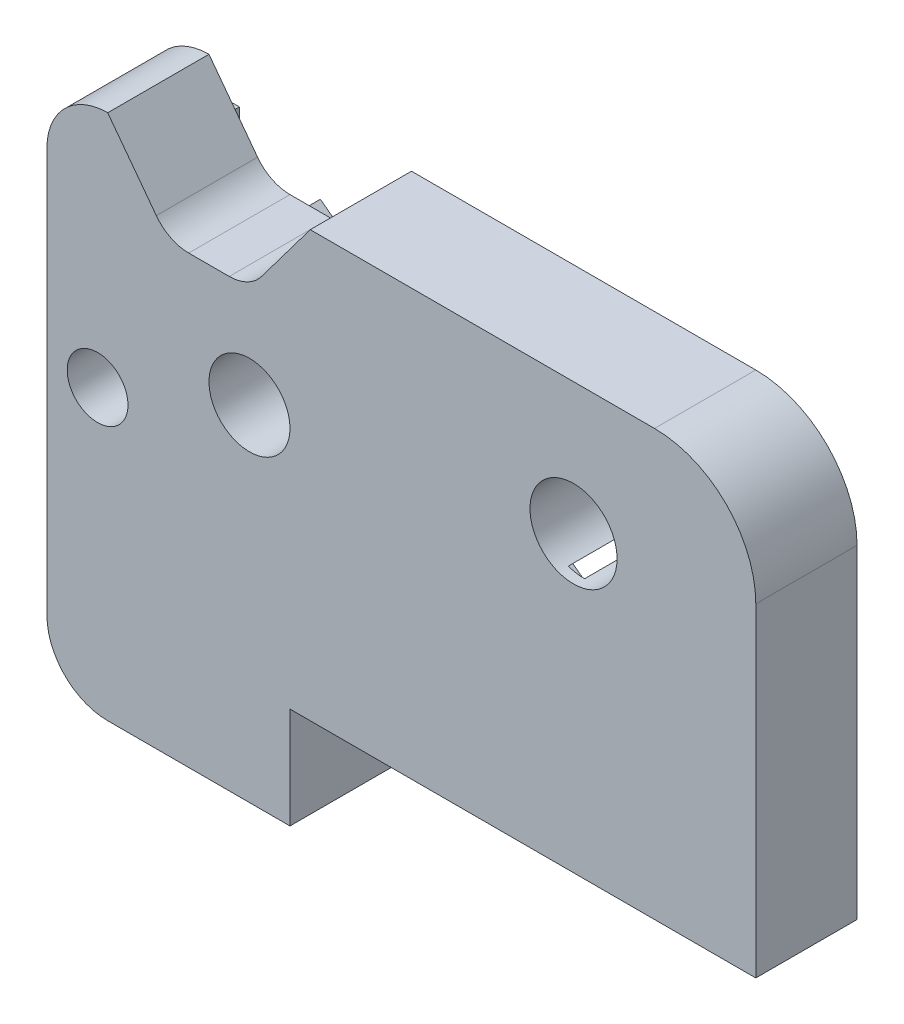
ISO-10303-21;
HEADER;
FILE_DESCRIPTION(('STEP AP214'),'2;1');
FILE_NAME('part.step','',(''),(''),'','','');
FILE_SCHEMA(('AUTOMOTIVE_DESIGN { 1 0 10303 214 1 1 1 1 }'));
ENDSEC;
DATA;
#1=APPLICATION_CONTEXT('core data for automotive mechanical design processes');
#2=APPLICATION_PROTOCOL_DEFINITION('international standard','automotive_design',2000,#1);
#3=PRODUCT_CONTEXT('',#1,'mechanical');
#4=PRODUCT('Part','Part','',(#3));
#5=PRODUCT_RELATED_PRODUCT_CATEGORY('part','',(#4));
#6=PRODUCT_DEFINITION_FORMATION('','',#4);
#7=PRODUCT_DEFINITION_CONTEXT('part definition',#1,'design');
#8=PRODUCT_DEFINITION('design','',#6,#7);
#9=PRODUCT_DEFINITION_SHAPE('','',#8);
#10=(LENGTH_UNIT() NAMED_UNIT(*) SI_UNIT(.MILLI.,.METRE.));
#11=(NAMED_UNIT(*) PLANE_ANGLE_UNIT() SI_UNIT($,.RADIAN.));
#12=(NAMED_UNIT(*) SI_UNIT($,.STERADIAN.) SOLID_ANGLE_UNIT());
#13=UNCERTAINTY_MEASURE_WITH_UNIT(LENGTH_MEASURE(1.E-05),#10,'distance_accuracy_value','');
#14=(GEOMETRIC_REPRESENTATION_CONTEXT(3) GLOBAL_UNCERTAINTY_ASSIGNED_CONTEXT((#13)) GLOBAL_UNIT_ASSIGNED_CONTEXT((#10,
#11,#12)) REPRESENTATION_CONTEXT('',''));
#15=CARTESIAN_POINT('',(0.,0.,0.));
#16=DIRECTION('',(0.,0.,1.));
#17=DIRECTION('',(1.,0.,0.));
#18=AXIS2_PLACEMENT_3D('',#15,#16,#17);
#19=CARTESIAN_POINT('',(-8.,6.5,0.));
#20=DIRECTION('',(0.,0.,1.));
#21=DIRECTION('',(1.,0.,0.));
#22=AXIS2_PLACEMENT_3D('',#19,#20,#21);
#23=PLANE('',#22);
#24=CARTESIAN_POINT('',(-17.,3.5,0.));
#25=DIRECTION('',(0.,0.,1.));
#26=DIRECTION('',(1.,0.,0.));
#27=AXIS2_PLACEMENT_3D('',#24,#25,#26);
#28=CIRCLE('',#27,3.);
#29=CARTESIAN_POINT('',(-20.,3.5,0.));
#30=VERTEX_POINT('',#29);
#31=CARTESIAN_POINT('',(-17.,6.5,0.));
#32=VERTEX_POINT('',#31);
#33=EDGE_CURVE('E416',#30,#32,#28,.F.);
#34=ORIENTED_EDGE('',*,*,#33,.T.);
#35=DIRECTION('',(-0.6,0.8,0.));
#36=VECTOR('',#35,1.);
#37=CARTESIAN_POINT('',(-14.,2.5,0.));
#38=LINE('',#37,#36);
#39=CARTESIAN_POINT('',(-14.6,3.3,0.));
#40=VERTEX_POINT('',#39);
#41=EDGE_CURVE('E223',#40,#32,#38,.T.);
#42=ORIENTED_EDGE('',*,*,#41,.F.);
#43=CARTESIAN_POINT('',(-13.,4.5,0.));
#44=DIRECTION('',(0.,0.,1.));
#45=DIRECTION('',(1.,0.,0.));
#46=AXIS2_PLACEMENT_3D('',#43,#44,#45);
#47=CIRCLE('',#46,2.);
#48=CARTESIAN_POINT('',(-13.,2.5,0.));
#49=VERTEX_POINT('',#48);
#50=EDGE_CURVE('E11',#40,#49,#47,.T.);
#51=ORIENTED_EDGE('',*,*,#50,.T.);
#52=DIRECTION('',(-1.,0.,0.));
#53=VECTOR('',#52,1.);
#54=CARTESIAN_POINT('',(-14.,2.5,0.));
#55=LINE('',#54,#53);
#56=CARTESIAN_POINT('',(-11.,2.5,0.));
#57=VERTEX_POINT('',#56);
#58=EDGE_CURVE('E513',#57,#49,#55,.T.);
#59=ORIENTED_EDGE('',*,*,#58,.F.);
#60=CARTESIAN_POINT('',(-11.,4.5,0.));
#61=DIRECTION('',(0.,0.,1.));
#62=DIRECTION('',(1.,0.,0.));
#63=AXIS2_PLACEMENT_3D('',#60,#61,#62);
#64=CIRCLE('',#63,2.);
#65=CARTESIAN_POINT('',(-9.40000000000001,3.3,0.));
#66=VERTEX_POINT('',#65);
#67=EDGE_CURVE('E374',#57,#66,#64,.T.);
#68=ORIENTED_EDGE('',*,*,#67,.T.);
#69=DIRECTION('',(-0.600000000000001,-0.799999999999999,0.));
#70=VECTOR('',#69,1.);
#71=CARTESIAN_POINT('',(-10.,2.5,0.));
#72=LINE('',#71,#70);
#73=CARTESIAN_POINT('',(-7.,6.5,0.));
#74=VERTEX_POINT('',#73);
#75=EDGE_CURVE('E392',#74,#66,#72,.T.);
#76=ORIENTED_EDGE('',*,*,#75,.F.);
#77=DIRECTION('',(-1.,0.,0.));
#78=VECTOR('',#77,1.);
#79=CARTESIAN_POINT('',(15.,6.5,0.));
#80=LINE('',#79,#78);
#81=CARTESIAN_POINT('',(10.,6.5,0.));
#82=VERTEX_POINT('',#81);
#83=EDGE_CURVE('E222',#82,#74,#80,.T.);
#84=ORIENTED_EDGE('',*,*,#83,.F.);
#85=CARTESIAN_POINT('',(10.,1.5,0.));
#86=DIRECTION('',(0.,0.,1.));
#87=DIRECTION('',(1.,0.,0.));
#88=AXIS2_PLACEMENT_3D('',#85,#86,#87);
#89=CIRCLE('',#88,5.);
#90=CARTESIAN_POINT('',(15.,1.49999999999999,0.));
#91=VERTEX_POINT('',#90);
#92=EDGE_CURVE('E511',#82,#91,#89,.F.);
#93=ORIENTED_EDGE('',*,*,#92,.T.);
#94=DIRECTION('',(0.,1.,0.));
#95=VECTOR('',#94,1.);
#96=CARTESIAN_POINT('',(15.,-14.5,0.));
#97=LINE('',#96,#95);
#98=CARTESIAN_POINT('',(15.,-14.5,0.));
#99=VERTEX_POINT('',#98);
#100=EDGE_CURVE('E231',#99,#91,#97,.T.);
#101=ORIENTED_EDGE('',*,*,#100,.F.);
#102=DIRECTION('',(1.,0.,0.));
#103=VECTOR('',#102,1.);
#104=CARTESIAN_POINT('',(-8.,-14.5,0.));
#105=LINE('',#104,#103);
#106=CARTESIAN_POINT('',(-2.00000000000001,-14.5,0.));
#107=VERTEX_POINT('',#106);
#108=EDGE_CURVE('E236',#107,#99,#105,.T.);
#109=ORIENTED_EDGE('',*,*,#108,.F.);
#110=DIRECTION('',(0.,-1.,0.));
#111=VECTOR('',#110,1.);
#112=CARTESIAN_POINT('',(-2.,-11.07,0.));
#113=LINE('',#112,#111);
#114=CARTESIAN_POINT('',(-2.,-11.07,0.));
#115=VERTEX_POINT('',#114);
#116=EDGE_CURVE('E430',#115,#107,#113,.T.);
#117=ORIENTED_EDGE('',*,*,#116,.F.);
#118=DIRECTION('',(0.800119256629199,-0.599840958230711,0.));
#119=VECTOR('',#118,1.);
#120=CARTESIAN_POINT('',(-18.1,1.,0.));
#121=LINE('',#120,#119);
#122=CARTESIAN_POINT('',(-15.5,-0.949192546583849,0.));
#123=VERTEX_POINT('',#122);
#124=EDGE_CURVE('E435',#123,#115,#121,.T.);
#125=ORIENTED_EDGE('',*,*,#124,.F.);
#126=DIRECTION('',(0.,-1.,0.));
#127=VECTOR('',#126,1.);
#128=CARTESIAN_POINT('',(-15.5,-7.49999999999999,0.));
#129=LINE('',#128,#127);
#130=CARTESIAN_POINT('',(-15.5,-5.49999999999999,0.));
#131=VERTEX_POINT('',#130);
#132=EDGE_CURVE('E527',#123,#131,#129,.T.);
#133=ORIENTED_EDGE('',*,*,#132,.T.);
#134=CARTESIAN_POINT('',(-17.5,-5.49999999999999,0.));
#135=DIRECTION('',(0.,0.,1.));
#136=DIRECTION('',(1.,0.,0.));
#137=AXIS2_PLACEMENT_3D('',#134,#135,#136);
#138=CIRCLE('',#137,2.);
#139=CARTESIAN_POINT('',(-17.5,-7.49999999999999,0.));
#140=VERTEX_POINT('',#139);
#141=EDGE_CURVE('E400',#131,#140,#138,.F.);
#142=ORIENTED_EDGE('',*,*,#141,.T.);
#143=CARTESIAN_POINT('',(-17.5,-5.49999999999999,0.));
#144=DIRECTION('',(0.,0.,1.));
#145=DIRECTION('',(1.,0.,0.));
#146=AXIS2_PLACEMENT_3D('',#143,#144,#145);
#147=CIRCLE('',#146,2.);
#148=CARTESIAN_POINT('',(-19.5,-5.49999999999999,0.));
#149=VERTEX_POINT('',#148);
#150=EDGE_CURVE('E398',#140,#149,#147,.F.);
#151=ORIENTED_EDGE('',*,*,#150,.T.);
#152=DIRECTION('',(0.,1.,0.));
#153=VECTOR('',#152,1.);
#154=CARTESIAN_POINT('',(-19.5,1.00000000000001,0.));
#155=LINE('',#154,#153);
#156=CARTESIAN_POINT('',(-19.5,1.00000000000001,0.));
#157=VERTEX_POINT('',#156);
#158=EDGE_CURVE('E524',#149,#157,#155,.T.);
#159=ORIENTED_EDGE('',*,*,#158,.T.);
#160=DIRECTION('',(1.,0.,0.));
#161=VECTOR('',#160,1.);
#162=CARTESIAN_POINT('',(-20.,1.,0.));
#163=LINE('',#162,#161);
#164=CARTESIAN_POINT('',(-20.,1.00000000000001,0.));
#165=VERTEX_POINT('',#164);
#166=EDGE_CURVE('E269',#165,#157,#163,.T.);
#167=ORIENTED_EDGE('',*,*,#166,.F.);
#168=DIRECTION('',(0.,1.,0.));
#169=VECTOR('',#168,1.);
#170=CARTESIAN_POINT('',(-20.,6.5,0.));
#171=LINE('',#170,#169);
#172=EDGE_CURVE('E263',#165,#30,#171,.T.);
#173=ORIENTED_EDGE('',*,*,#172,.T.);
#174=EDGE_LOOP('',(#34,#42,#51,#59,#68,#76,#84,#93,#101,#109,#117,#125,#133,#142,#151,#159,#167,#173));
#175=FACE_BOUND('',#174,.T.);
#176=CARTESIAN_POINT('',(4.9,-6.5,0.));
#177=DIRECTION('',(0.,0.,-1.));
#178=DIRECTION('',(-1.,0.,0.));
#179=AXIS2_PLACEMENT_3D('',#176,#177,#178);
#180=CIRCLE('',#179,4.5);
#181=CARTESIAN_POINT('',(0.4,-6.5,0.));
#182=VERTEX_POINT('',#181);
#183=EDGE_CURVE('E289',#182,#182,#180,.T.);
#184=ORIENTED_EDGE('',*,*,#183,.F.);
#185=EDGE_LOOP('',(#184));
#186=FACE_BOUND('',#185,.T.);
#187=CARTESIAN_POINT('',(-17.5,-5.5,0.));
#188=DIRECTION('',(0.,0.,1.));
#189=DIRECTION('',(1.,0.,0.));
#190=AXIS2_PLACEMENT_3D('',#187,#188,#189);
#191=CIRCLE('',#190,1.5);
#192=CARTESIAN_POINT('',(-16.,-5.5,0.));
#193=VERTEX_POINT('',#192);
#194=EDGE_CURVE('E532',#193,#193,#191,.F.);
#195=ORIENTED_EDGE('',*,*,#194,.F.);
#196=EDGE_LOOP('',(#195));
#197=FACE_BOUND('',#196,.T.);
#198=ADVANCED_FACE('F36',(#175,#186,#197),#23,.F.);
#199=CARTESIAN_POINT('',(15.,6.5,5.));
#200=DIRECTION('',(0.,-1.,0.));
#201=DIRECTION('',(1.,0.,0.));
#202=AXIS2_PLACEMENT_3D('',#199,#200,#201);
#203=PLANE('',#202);
#204=ORIENTED_EDGE('',*,*,#83,.T.);
#205=DIRECTION('',(0.,0.,1.));
#206=VECTOR('',#205,1.);
#207=CARTESIAN_POINT('',(-7.,6.5,-10.770329614269));
#208=LINE('',#207,#206);
#209=CARTESIAN_POINT('',(-7.,6.5,5.));
#210=VERTEX_POINT('',#209);
#211=EDGE_CURVE('E206',#74,#210,#208,.T.);
#212=ORIENTED_EDGE('',*,*,#211,.T.);
#213=DIRECTION('',(-1.,0.,0.));
#214=VECTOR('',#213,1.);
#215=CARTESIAN_POINT('',(15.,6.5,5.));
#216=LINE('',#215,#214);
#217=CARTESIAN_POINT('',(10.,6.5,5.));
#218=VERTEX_POINT('',#217);
#219=EDGE_CURVE('E219',#218,#210,#216,.T.);
#220=ORIENTED_EDGE('',*,*,#219,.F.);
#221=DIRECTION('',(0.,0.,-1.));
#222=VECTOR('',#221,1.);
#223=CARTESIAN_POINT('',(10.,6.5,5.));
#224=LINE('',#223,#222);
#225=EDGE_CURVE('E251',#218,#82,#224,.T.);
#226=ORIENTED_EDGE('',*,*,#225,.T.);
#227=EDGE_LOOP('',(#204,#212,#220,#226));
#228=FACE_BOUND('',#227,.T.);
#229=ADVANCED_FACE('F217',(#228),#203,.F.);
#230=CARTESIAN_POINT('',(-8.,-14.5,5.));
#231=DIRECTION('',(0.,1.,0.));
#232=DIRECTION('',(0.,0.,1.));
#233=AXIS2_PLACEMENT_3D('',#230,#231,#232);
#234=PLANE('',#233);
#235=CARTESIAN_POINT('',(12.,-14.5,2.5));
#236=DIRECTION('',(0.,-1.,0.));
#237=DIRECTION('',(0.,0.,-1.));
#238=AXIS2_PLACEMENT_3D('',#235,#236,#237);
#239=CIRCLE('',#238,1.25);
#240=CARTESIAN_POINT('',(12.,-14.5,1.25));
#241=VERTEX_POINT('',#240);
#242=EDGE_CURVE('E297',#241,#241,#239,.T.);
#243=ORIENTED_EDGE('',*,*,#242,.F.);
#244=EDGE_LOOP('',(#243));
#245=FACE_BOUND('',#244,.T.);
#246=CARTESIAN_POINT('',(-1.4,-14.5,2.5));
#247=DIRECTION('',(0.,-1.,0.));
#248=DIRECTION('',(0.,0.,-1.));
#249=AXIS2_PLACEMENT_3D('',#246,#247,#248);
#250=CIRCLE('',#249,1.25);
#251=CARTESIAN_POINT('',(-1.4,-14.5,1.25));
#252=VERTEX_POINT('',#251);
#253=EDGE_CURVE('E300',#252,#252,#250,.T.);
#254=ORIENTED_EDGE('',*,*,#253,.F.);
#255=EDGE_LOOP('',(#254));
#256=FACE_BOUND('',#255,.T.);
#257=DIRECTION('',(0.,0.,-1.));
#258=VECTOR('',#257,1.);
#259=CARTESIAN_POINT('',(-8.,-14.5,5.));
#260=LINE('',#259,#258);
#261=CARTESIAN_POINT('',(-8.,-14.5,5.));
#262=VERTEX_POINT('',#261);
#263=CARTESIAN_POINT('',(-8.,-14.5,-4.));
#264=VERTEX_POINT('',#263);
#265=EDGE_CURVE('E248',#262,#264,#260,.T.);
#266=ORIENTED_EDGE('',*,*,#265,.T.);
#267=DIRECTION('',(-1.,0.,0.));
#268=VECTOR('',#267,1.);
#269=CARTESIAN_POINT('',(-2.00000000000001,-14.5,-4.));
#270=LINE('',#269,#268);
#271=CARTESIAN_POINT('',(-2.00000000000001,-14.5,-4.));
#272=VERTEX_POINT('',#271);
#273=EDGE_CURVE('E543',#272,#264,#270,.T.);
#274=ORIENTED_EDGE('',*,*,#273,.F.);
#275=DIRECTION('',(0.,0.,1.));
#276=VECTOR('',#275,1.);
#277=CARTESIAN_POINT('',(-2.00000000000001,-14.5,-4.));
#278=LINE('',#277,#276);
#279=EDGE_CURVE('E425',#272,#107,#278,.T.);
#280=ORIENTED_EDGE('',*,*,#279,.T.);
#281=ORIENTED_EDGE('',*,*,#108,.T.);
#282=DIRECTION('',(0.,0.,-1.));
#283=VECTOR('',#282,1.);
#284=CARTESIAN_POINT('',(15.,-14.5,5.));
#285=LINE('',#284,#283);
#286=CARTESIAN_POINT('',(15.,-14.5,5.));
#287=VERTEX_POINT('',#286);
#288=EDGE_CURVE('E243',#287,#99,#285,.T.);
#289=ORIENTED_EDGE('',*,*,#288,.F.);
#290=DIRECTION('',(1.,0.,0.));
#291=VECTOR('',#290,1.);
#292=CARTESIAN_POINT('',(-8.,-14.5,5.));
#293=LINE('',#292,#291);
#294=EDGE_CURVE('E230',#262,#287,#293,.T.);
#295=ORIENTED_EDGE('',*,*,#294,.F.);
#296=EDGE_LOOP('',(#266,#274,#280,#281,#289,#295));
#297=FACE_BOUND('',#296,.T.);
#298=ADVANCED_FACE('F321',(#245,#256,#297),#234,.F.);
#299=CARTESIAN_POINT('',(15.,-14.5,5.));
#300=DIRECTION('',(-1.,0.,0.));
#301=DIRECTION('',(0.,0.,1.));
#302=AXIS2_PLACEMENT_3D('',#299,#300,#301);
#303=PLANE('',#302);
#304=ORIENTED_EDGE('',*,*,#100,.T.);
#305=DIRECTION('',(0.,0.,-1.));
#306=VECTOR('',#305,1.);
#307=CARTESIAN_POINT('',(15.,1.5,5.));
#308=LINE('',#307,#306);
#309=CARTESIAN_POINT('',(15.,1.49999999999999,5.));
#310=VERTEX_POINT('',#309);
#311=EDGE_CURVE('E508',#91,#310,#308,.F.);
#312=ORIENTED_EDGE('',*,*,#311,.T.);
#313=DIRECTION('',(0.,1.,0.));
#314=VECTOR('',#313,1.);
#315=CARTESIAN_POINT('',(15.,-14.5,5.));
#316=LINE('',#315,#314);
#317=EDGE_CURVE('E233',#287,#310,#316,.T.);
#318=ORIENTED_EDGE('',*,*,#317,.F.);
#319=ORIENTED_EDGE('',*,*,#288,.T.);
#320=EDGE_LOOP('',(#304,#312,#318,#319));
#321=FACE_BOUND('',#320,.T.);
#322=ADVANCED_FACE('F312',(#321),#303,.F.);
#323=CARTESIAN_POINT('',(-8.,6.5,5.));
#324=DIRECTION('',(0.,0.,1.));
#325=DIRECTION('',(1.,0.,0.));
#326=AXIS2_PLACEMENT_3D('',#323,#324,#325);
#327=PLANE('',#326);
#328=DIRECTION('',(0.6,-0.8,0.));
#329=VECTOR('',#328,1.);
#330=CARTESIAN_POINT('',(-14.,2.5,5.));
#331=LINE('',#330,#329);
#332=CARTESIAN_POINT('',(-17.,6.5,5.));
#333=VERTEX_POINT('',#332);
#334=CARTESIAN_POINT('',(-14.6,3.3,5.));
#335=VERTEX_POINT('',#334);
#336=EDGE_CURVE('E211',#333,#335,#331,.T.);
#337=ORIENTED_EDGE('',*,*,#336,.F.);
#338=CARTESIAN_POINT('',(-17.,3.5,5.));
#339=DIRECTION('',(0.,0.,1.));
#340=DIRECTION('',(1.,0.,0.));
#341=AXIS2_PLACEMENT_3D('',#338,#339,#340);
#342=CIRCLE('',#341,3.);
#343=CARTESIAN_POINT('',(-20.,3.5,5.));
#344=VERTEX_POINT('',#343);
#345=EDGE_CURVE('E410',#333,#344,#342,.T.);
#346=ORIENTED_EDGE('',*,*,#345,.T.);
#347=DIRECTION('',(0.,1.,0.));
#348=VECTOR('',#347,1.);
#349=CARTESIAN_POINT('',(-20.,6.5,5.));
#350=LINE('',#349,#348);
#351=CARTESIAN_POINT('',(-20.,-16.5,5.));
#352=VERTEX_POINT('',#351);
#353=EDGE_CURVE('E277',#352,#344,#350,.T.);
#354=ORIENTED_EDGE('',*,*,#353,.F.);
#355=CARTESIAN_POINT('',(-17.,-16.5,5.));
#356=DIRECTION('',(0.,0.,1.));
#357=DIRECTION('',(1.,0.,0.));
#358=AXIS2_PLACEMENT_3D('',#355,#356,#357);
#359=CIRCLE('',#358,3.);
#360=CARTESIAN_POINT('',(-17.,-19.5,5.));
#361=VERTEX_POINT('',#360);
#362=EDGE_CURVE('E412',#352,#361,#359,.T.);
#363=ORIENTED_EDGE('',*,*,#362,.T.);
#364=DIRECTION('',(-1.,0.,0.));
#365=VECTOR('',#364,1.);
#366=CARTESIAN_POINT('',(-8.,-19.5,5.));
#367=LINE('',#366,#365);
#368=CARTESIAN_POINT('',(-8.,-19.5,5.));
#369=VERTEX_POINT('',#368);
#370=EDGE_CURVE('E267',#369,#361,#367,.T.);
#371=ORIENTED_EDGE('',*,*,#370,.F.);
#372=DIRECTION('',(0.,-1.,0.));
#373=VECTOR('',#372,1.);
#374=CARTESIAN_POINT('',(-8.,6.5,5.));
#375=LINE('',#374,#373);
#376=EDGE_CURVE('E282',#262,#369,#375,.T.);
#377=ORIENTED_EDGE('',*,*,#376,.F.);
#378=ORIENTED_EDGE('',*,*,#294,.T.);
#379=ORIENTED_EDGE('',*,*,#317,.T.);
#380=CARTESIAN_POINT('',(10.,1.5,5.));
#381=DIRECTION('',(0.,0.,1.));
#382=DIRECTION('',(1.,0.,0.));
#383=AXIS2_PLACEMENT_3D('',#380,#381,#382);
#384=CIRCLE('',#383,5.);
#385=EDGE_CURVE('E229',#310,#218,#384,.T.);
#386=ORIENTED_EDGE('',*,*,#385,.T.);
#387=ORIENTED_EDGE('',*,*,#219,.T.);
#388=DIRECTION('',(0.600000000000001,0.799999999999999,0.));
#389=VECTOR('',#388,1.);
#390=CARTESIAN_POINT('',(-10.,2.5,5.));
#391=LINE('',#390,#389);
#392=CARTESIAN_POINT('',(-9.40000000000001,3.3,5.));
#393=VERTEX_POINT('',#392);
#394=EDGE_CURVE('E202',#393,#210,#391,.T.);
#395=ORIENTED_EDGE('',*,*,#394,.F.);
#396=CARTESIAN_POINT('',(-11.,4.5,5.));
#397=DIRECTION('',(0.,0.,1.));
#398=DIRECTION('',(1.,0.,0.));
#399=AXIS2_PLACEMENT_3D('',#396,#397,#398);
#400=CIRCLE('',#399,2.);
#401=CARTESIAN_POINT('',(-11.,2.5,5.));
#402=VERTEX_POINT('',#401);
#403=EDGE_CURVE('E377',#393,#402,#400,.F.);
#404=ORIENTED_EDGE('',*,*,#403,.T.);
#405=DIRECTION('',(1.,0.,0.));
#406=VECTOR('',#405,1.);
#407=CARTESIAN_POINT('',(-14.,2.5,5.));
#408=LINE('',#407,#406);
#409=CARTESIAN_POINT('',(-13.,2.5,5.));
#410=VERTEX_POINT('',#409);
#411=EDGE_CURVE('E212',#410,#402,#408,.T.);
#412=ORIENTED_EDGE('',*,*,#411,.F.);
#413=CARTESIAN_POINT('',(-13.,4.5,5.));
#414=DIRECTION('',(0.,0.,1.));
#415=DIRECTION('',(1.,0.,0.));
#416=AXIS2_PLACEMENT_3D('',#413,#414,#415);
#417=CIRCLE('',#416,2.);
#418=EDGE_CURVE('E44',#410,#335,#417,.F.);
#419=ORIENTED_EDGE('',*,*,#418,.T.);
#420=EDGE_LOOP('',(#337,#346,#354,#363,#371,#377,#378,#379,#386,#387,#395,#404,#412,#419));
#421=FACE_BOUND('',#420,.T.);
#422=CARTESIAN_POINT('',(-10.,-2.5,5.));
#423=DIRECTION('',(0.,0.,1.));
#424=DIRECTION('',(1.,0.,0.));
#425=AXIS2_PLACEMENT_3D('',#422,#423,#424);
#426=CIRCLE('',#425,2.);
#427=CARTESIAN_POINT('',(-8.,-2.5,5.));
#428=VERTEX_POINT('',#427);
#429=EDGE_CURVE('E451',#428,#428,#426,.T.);
#430=ORIENTED_EDGE('',*,*,#429,.F.);
#431=EDGE_LOOP('',(#430));
#432=FACE_BOUND('',#431,.T.);
#433=CARTESIAN_POINT('',(-17.5,-5.5,5.));
#434=DIRECTION('',(0.,0.,1.));
#435=DIRECTION('',(1.,0.,0.));
#436=AXIS2_PLACEMENT_3D('',#433,#434,#435);
#437=CIRCLE('',#436,1.5);
#438=CARTESIAN_POINT('',(-16.,-5.5,5.));
#439=VERTEX_POINT('',#438);
#440=EDGE_CURVE('E268',#439,#439,#437,.T.);
#441=ORIENTED_EDGE('',*,*,#440,.F.);
#442=EDGE_LOOP('',(#441));
#443=FACE_BOUND('',#442,.T.);
#444=CARTESIAN_POINT('',(6.,0.,5.));
#445=DIRECTION('',(0.,0.,1.));
#446=DIRECTION('',(1.,0.,0.));
#447=AXIS2_PLACEMENT_3D('',#444,#445,#446);
#448=CIRCLE('',#447,2.15);
#449=CARTESIAN_POINT('',(8.15,0.,5.));
#450=VERTEX_POINT('',#449);
#451=EDGE_CURVE('E240',#450,#450,#448,.T.);
#452=ORIENTED_EDGE('',*,*,#451,.F.);
#453=EDGE_LOOP('',(#452));
#454=FACE_BOUND('',#453,.T.);
#455=ADVANCED_FACE('F225',(#421,#432,#443,#454),#327,.T.);
#456=CARTESIAN_POINT('',(6.,0.,0.5));
#457=DIRECTION('',(0.,0.,1.));
#458=DIRECTION('',(1.,0.,0.));
#459=AXIS2_PLACEMENT_3D('',#456,#457,#458);
#460=CYLINDRICAL_SURFACE('',#459,2.15);
#461=CARTESIAN_POINT('',(6.,0.,0.5));
#462=DIRECTION('',(0.,0.,1.));
#463=DIRECTION('',(1.,0.,0.));
#464=AXIS2_PLACEMENT_3D('',#461,#462,#463);
#465=CIRCLE('',#464,2.15);
#466=CARTESIAN_POINT('',(6.0499763573965,-2.1494190758671,0.5));
#467=VERTEX_POINT('',#466);
#468=CARTESIAN_POINT('',(5.24556552019209,-2.01328801110943,0.5));
#469=VERTEX_POINT('',#468);
#470=EDGE_CURVE('E244',#467,#469,#465,.T.);
#471=ORIENTED_EDGE('',*,*,#470,.F.);
#472=DIRECTION('',(0.,0.,-1.));
#473=VECTOR('',#472,1.);
#474=CARTESIAN_POINT('',(6.0499763573965,-2.1494190758671,2.25));
#475=LINE('',#474,#473);
#476=CARTESIAN_POINT('',(6.0499763573965,-2.1494190758671,4.5));
#477=VERTEX_POINT('',#476);
#478=EDGE_CURVE('E294',#467,#477,#475,.F.);
#479=ORIENTED_EDGE('',*,*,#478,.T.);
#480=CARTESIAN_POINT('',(6.,0.,4.5));
#481=DIRECTION('',(0.,0.,-1.));
#482=DIRECTION('',(-1.,0.,0.));
#483=AXIS2_PLACEMENT_3D('',#480,#481,#482);
#484=CIRCLE('',#483,2.15);
#485=CARTESIAN_POINT('',(5.24556552019209,-2.01328801110943,4.5));
#486=VERTEX_POINT('',#485);
#487=EDGE_CURVE('E256',#486,#477,#484,.F.);
#488=ORIENTED_EDGE('',*,*,#487,.F.);
#489=DIRECTION('',(0.,0.,-1.));
#490=VECTOR('',#489,1.);
#491=CARTESIAN_POINT('',(5.24556552019209,-2.01328801110943,2.25));
#492=LINE('',#491,#490);
#493=EDGE_CURVE('E288',#486,#469,#492,.T.);
#494=ORIENTED_EDGE('',*,*,#493,.T.);
#495=EDGE_LOOP('',(#471,#479,#488,#494));
#496=FACE_BOUND('',#495,.T.);
#497=ORIENTED_EDGE('',*,*,#451,.T.);
#498=EDGE_LOOP('',(#497));
#499=FACE_BOUND('',#498,.T.);
#500=ADVANCED_FACE('F309',(#496,#499),#460,.F.);
#501=CARTESIAN_POINT('',(6.,0.,0.5));
#502=DIRECTION('',(0.,0.,1.));
#503=DIRECTION('',(1.,0.,0.));
#504=AXIS2_PLACEMENT_3D('',#501,#502,#503);
#505=PLANE('',#504);
#506=CARTESIAN_POINT('',(4.9,-6.5,0.5));
#507=DIRECTION('',(0.,0.,1.));
#508=DIRECTION('',(1.,0.,0.));
#509=AXIS2_PLACEMENT_3D('',#506,#507,#508);
#510=CIRCLE('',#509,4.5);
#511=EDGE_CURVE('E504',#467,#469,#510,.T.);
#512=ORIENTED_EDGE('',*,*,#511,.F.);
#513=ORIENTED_EDGE('',*,*,#470,.T.);
#514=EDGE_LOOP('',(#512,#513));
#515=FACE_BOUND('',#514,.T.);
#516=ADVANCED_FACE('F318',(#515),#505,.T.);
#517=CARTESIAN_POINT('',(-1.4,-6.5,2.5));
#518=DIRECTION('',(0.,-1.,0.));
#519=DIRECTION('',(0.,0.,-1.));
#520=AXIS2_PLACEMENT_3D('',#517,#518,#519);
#521=CYLINDRICAL_SURFACE('',#520,1.25);
#522=CARTESIAN_POINT('',(-1.4,-6.5,2.5));
#523=DIRECTION('',(0.,-1.,0.));
#524=DIRECTION('',(0.,0.,-1.));
#525=AXIS2_PLACEMENT_3D('',#522,#523,#524);
#526=CIRCLE('',#525,1.25);
#527=CARTESIAN_POINT('',(-1.4,-6.5,1.25));
#528=VERTEX_POINT('',#527);
#529=EDGE_CURVE('E445',#528,#528,#526,.T.);
#530=ORIENTED_EDGE('',*,*,#529,.F.);
#531=EDGE_LOOP('',(#530));
#532=FACE_BOUND('',#531,.T.);
#533=ORIENTED_EDGE('',*,*,#253,.T.);
#534=EDGE_LOOP('',(#533));
#535=FACE_BOUND('',#534,.T.);
#536=ADVANCED_FACE('F496',(#532,#535),#521,.F.);
#537=CARTESIAN_POINT('',(12.,-6.5,2.5));
#538=DIRECTION('',(0.,-1.,0.));
#539=DIRECTION('',(0.,0.,-1.));
#540=AXIS2_PLACEMENT_3D('',#537,#538,#539);
#541=CYLINDRICAL_SURFACE('',#540,1.25);
#542=CARTESIAN_POINT('',(12.,-6.5,2.5));
#543=DIRECTION('',(0.,-1.,0.));
#544=DIRECTION('',(0.,0.,-1.));
#545=AXIS2_PLACEMENT_3D('',#542,#543,#544);
#546=CIRCLE('',#545,1.25);
#547=CARTESIAN_POINT('',(12.,-6.5,1.25));
#548=VERTEX_POINT('',#547);
#549=EDGE_CURVE('E448',#548,#548,#546,.T.);
#550=ORIENTED_EDGE('',*,*,#549,.F.);
#551=EDGE_LOOP('',(#550));
#552=FACE_BOUND('',#551,.T.);
#553=ORIENTED_EDGE('',*,*,#242,.T.);
#554=EDGE_LOOP('',(#553));
#555=FACE_BOUND('',#554,.T.);
#556=ADVANCED_FACE('F341',(#552,#555),#541,.F.);
#557=CARTESIAN_POINT('',(10.,1.5,5.));
#558=DIRECTION('',(0.,0.,-1.));
#559=DIRECTION('',(-1.,0.,0.));
#560=AXIS2_PLACEMENT_3D('',#557,#558,#559);
#561=CYLINDRICAL_SURFACE('',#560,5.);
#562=ORIENTED_EDGE('',*,*,#385,.F.);
#563=ORIENTED_EDGE('',*,*,#311,.F.);
#564=ORIENTED_EDGE('',*,*,#92,.F.);
#565=ORIENTED_EDGE('',*,*,#225,.F.);
#566=EDGE_LOOP('',(#562,#563,#564,#565));
#567=FACE_BOUND('',#566,.T.);
#568=ADVANCED_FACE('F337',(#567),#561,.T.);
#569=CARTESIAN_POINT('',(4.9,-6.5,4.5));
#570=DIRECTION('',(0.,0.,-1.));
#571=DIRECTION('',(-1.,0.,0.));
#572=AXIS2_PLACEMENT_3D('',#569,#570,#571);
#573=PLANE('',#572);
#574=ORIENTED_EDGE('',*,*,#487,.T.);
#575=CARTESIAN_POINT('',(4.9,-6.5,4.5));
#576=DIRECTION('',(0.,0.,-1.));
#577=DIRECTION('',(-1.,0.,0.));
#578=AXIS2_PLACEMENT_3D('',#575,#576,#577);
#579=CIRCLE('',#578,4.5);
#580=EDGE_CURVE('E285',#477,#486,#579,.T.);
#581=ORIENTED_EDGE('',*,*,#580,.T.);
#582=EDGE_LOOP('',(#574,#581));
#583=FACE_BOUND('',#582,.T.);
#584=ADVANCED_FACE('F340',(#583),#573,.T.);
#585=CARTESIAN_POINT('',(4.9,-6.5,4.5));
#586=DIRECTION('',(0.,0.,-1.));
#587=DIRECTION('',(-1.,0.,0.));
#588=AXIS2_PLACEMENT_3D('',#585,#586,#587);
#589=CYLINDRICAL_SURFACE('',#588,4.5);
#590=ORIENTED_EDGE('',*,*,#183,.T.);
#591=EDGE_LOOP('',(#590));
#592=FACE_BOUND('',#591,.T.);
#593=ORIENTED_EDGE('',*,*,#511,.T.);
#594=ORIENTED_EDGE('',*,*,#493,.F.);
#595=ORIENTED_EDGE('',*,*,#580,.F.);
#596=ORIENTED_EDGE('',*,*,#478,.F.);
#597=EDGE_LOOP('',(#593,#594,#595,#596));
#598=FACE_BOUND('',#597,.T.);
#599=ADVANCED_FACE('F482',(#592,#598),#589,.F.);
#600=CARTESIAN_POINT('',(-8.,6.5,33.6356421265527));
#601=DIRECTION('',(1.,0.,0.));
#602=DIRECTION('',(0.,1.,0.));
#603=AXIS2_PLACEMENT_3D('',#600,#601,#602);
#604=PLANE('',#603);
#605=ORIENTED_EDGE('',*,*,#265,.F.);
#606=ORIENTED_EDGE('',*,*,#376,.T.);
#607=DIRECTION('',(0.,0.,-1.));
#608=VECTOR('',#607,1.);
#609=CARTESIAN_POINT('',(-8.,-19.5,33.6356421265527));
#610=LINE('',#609,#608);
#611=CARTESIAN_POINT('',(-8.,-19.5,-4.));
#612=VERTEX_POINT('',#611);
#613=EDGE_CURVE('E284',#369,#612,#610,.T.);
#614=ORIENTED_EDGE('',*,*,#613,.T.);
#615=DIRECTION('',(0.,-1.,0.));
#616=VECTOR('',#615,1.);
#617=CARTESIAN_POINT('',(-8.,-14.5,-4.));
#618=LINE('',#617,#616);
#619=EDGE_CURVE('E546',#264,#612,#618,.T.);
#620=ORIENTED_EDGE('',*,*,#619,.F.);
#621=EDGE_LOOP('',(#605,#606,#614,#620));
#622=FACE_BOUND('',#621,.T.);
#623=ADVANCED_FACE('F480',(#622),#604,.T.);
#624=CARTESIAN_POINT('',(-8.,-19.5,33.6356421265527));
#625=DIRECTION('',(0.,-1.,0.));
#626=DIRECTION('',(0.,0.,-1.));
#627=AXIS2_PLACEMENT_3D('',#624,#625,#626);
#628=PLANE('',#627);
#629=ORIENTED_EDGE('',*,*,#370,.T.);
#630=DIRECTION('',(0.,0.,-1.));
#631=VECTOR('',#630,1.);
#632=CARTESIAN_POINT('',(-17.,-19.5,33.6356421265527));
#633=LINE('',#632,#631);
#634=CARTESIAN_POINT('',(-17.,-19.5,-4.));
#635=VERTEX_POINT('',#634);
#636=EDGE_CURVE('E407',#361,#635,#633,.T.);
#637=ORIENTED_EDGE('',*,*,#636,.T.);
#638=DIRECTION('',(-1.,0.,0.));
#639=VECTOR('',#638,1.);
#640=CARTESIAN_POINT('',(-20.,-19.5,-4.));
#641=LINE('',#640,#639);
#642=EDGE_CURVE('E429',#612,#635,#641,.T.);
#643=ORIENTED_EDGE('',*,*,#642,.F.);
#644=ORIENTED_EDGE('',*,*,#613,.F.);
#645=EDGE_LOOP('',(#629,#637,#643,#644));
#646=FACE_BOUND('',#645,.T.);
#647=ADVANCED_FACE('F474',(#646),#628,.T.);
#648=CARTESIAN_POINT('',(-20.,6.5,33.6356421265527));
#649=DIRECTION('',(-1.,0.,0.));
#650=DIRECTION('',(0.,-1.,0.));
#651=AXIS2_PLACEMENT_3D('',#648,#649,#650);
#652=PLANE('',#651);
#653=ORIENTED_EDGE('',*,*,#353,.T.);
#654=DIRECTION('',(0.,0.,-1.));
#655=VECTOR('',#654,1.);
#656=CARTESIAN_POINT('',(-20.,3.5,0.));
#657=LINE('',#656,#655);
#658=EDGE_CURVE('E418',#344,#30,#657,.T.);
#659=ORIENTED_EDGE('',*,*,#658,.T.);
#660=ORIENTED_EDGE('',*,*,#172,.F.);
#661=DIRECTION('',(0.,0.,1.));
#662=VECTOR('',#661,1.);
#663=CARTESIAN_POINT('',(-20.,1.,-4.));
#664=LINE('',#663,#662);
#665=CARTESIAN_POINT('',(-20.,1.,-4.));
#666=VERTEX_POINT('',#665);
#667=EDGE_CURVE('E444',#666,#165,#664,.T.);
#668=ORIENTED_EDGE('',*,*,#667,.F.);
#669=DIRECTION('',(0.,1.,0.));
#670=VECTOR('',#669,1.);
#671=CARTESIAN_POINT('',(-20.,-19.5,-4.));
#672=LINE('',#671,#670);
#673=CARTESIAN_POINT('',(-20.,-16.5,-4.));
#674=VERTEX_POINT('',#673);
#675=EDGE_CURVE('E434',#674,#666,#672,.T.);
#676=ORIENTED_EDGE('',*,*,#675,.F.);
#677=DIRECTION('',(0.,0.,-1.));
#678=VECTOR('',#677,1.);
#679=CARTESIAN_POINT('',(-20.,-16.5,33.6356421265527));
#680=LINE('',#679,#678);
#681=EDGE_CURVE('E421',#674,#352,#680,.F.);
#682=ORIENTED_EDGE('',*,*,#681,.T.);
#683=EDGE_LOOP('',(#653,#659,#660,#668,#676,#682));
#684=FACE_BOUND('',#683,.T.);
#685=ADVANCED_FACE('F464',(#684),#652,.T.);
#686=CARTESIAN_POINT('',(-17.5,-5.5,-4.24264068711929));
#687=DIRECTION('',(0.,0.,1.));
#688=DIRECTION('',(1.,0.,0.));
#689=AXIS2_PLACEMENT_3D('',#686,#687,#688);
#690=CYLINDRICAL_SURFACE('',#689,1.5);
#691=ORIENTED_EDGE('',*,*,#194,.T.);
#692=EDGE_LOOP('',(#691));
#693=FACE_BOUND('',#692,.T.);
#694=ORIENTED_EDGE('',*,*,#440,.T.);
#695=EDGE_LOOP('',(#694));
#696=FACE_BOUND('',#695,.T.);
#697=ADVANCED_FACE('F462',(#693,#696),#690,.F.);
#698=CARTESIAN_POINT('',(-10.,-2.5,1.));
#699=DIRECTION('',(0.,0.,1.));
#700=DIRECTION('',(1.,0.,0.));
#701=AXIS2_PLACEMENT_3D('',#698,#699,#700);
#702=CYLINDRICAL_SURFACE('',#701,2.);
#703=CARTESIAN_POINT('',(-10.,-2.5,1.));
#704=DIRECTION('',(0.,0.,1.));
#705=DIRECTION('',(1.,0.,0.));
#706=AXIS2_PLACEMENT_3D('',#703,#704,#705);
#707=CIRCLE('',#706,2.);
#708=CARTESIAN_POINT('',(-8.,-2.5,1.));
#709=VERTEX_POINT('',#708);
#710=EDGE_CURVE('E452',#709,#709,#707,.T.);
#711=ORIENTED_EDGE('',*,*,#710,.F.);
#712=EDGE_LOOP('',(#711));
#713=FACE_BOUND('',#712,.T.);
#714=ORIENTED_EDGE('',*,*,#429,.T.);
#715=EDGE_LOOP('',(#714));
#716=FACE_BOUND('',#715,.T.);
#717=ADVANCED_FACE('F457',(#713,#716),#702,.F.);
#718=CARTESIAN_POINT('',(-10.,-2.5,1.));
#719=DIRECTION('',(0.,0.,1.));
#720=DIRECTION('',(1.,0.,0.));
#721=AXIS2_PLACEMENT_3D('',#718,#719,#720);
#722=PLANE('',#721);
#723=ORIENTED_EDGE('',*,*,#710,.T.);
#724=EDGE_LOOP('',(#723));
#725=FACE_BOUND('',#724,.T.);
#726=ADVANCED_FACE('F471',(#725),#722,.T.);
#727=CARTESIAN_POINT('',(12.,-6.5,2.5));
#728=DIRECTION('',(0.,-1.,0.));
#729=DIRECTION('',(0.,0.,-1.));
#730=AXIS2_PLACEMENT_3D('',#727,#728,#729);
#731=CONICAL_SURFACE('',#730,1.25,1.02974425867665);
#732=CARTESIAN_POINT('',(12.,-5.74892422621555,2.5));
#733=VERTEX_POINT('',#732);
#734=VERTEX_LOOP('',#733);
#735=FACE_BOUND('',#734,.T.);
#736=ORIENTED_EDGE('',*,*,#549,.T.);
#737=EDGE_LOOP('',(#736));
#738=FACE_BOUND('',#737,.T.);
#739=ADVANCED_FACE('F606',(#735,#738),#731,.F.);
#740=CARTESIAN_POINT('',(-1.4,-6.5,2.5));
#741=DIRECTION('',(0.,-1.,0.));
#742=DIRECTION('',(0.,0.,-1.));
#743=AXIS2_PLACEMENT_3D('',#740,#741,#742);
#744=CONICAL_SURFACE('',#743,1.25,1.02974425867665);
#745=CARTESIAN_POINT('',(-1.4,-5.74892422621555,2.5));
#746=VERTEX_POINT('',#745);
#747=VERTEX_LOOP('',#746);
#748=FACE_BOUND('',#747,.T.);
#749=ORIENTED_EDGE('',*,*,#529,.T.);
#750=EDGE_LOOP('',(#749));
#751=FACE_BOUND('',#750,.T.);
#752=ADVANCED_FACE('F603',(#748,#751),#744,.F.);
#753=CARTESIAN_POINT('',(-20.,1.,-4.));
#754=DIRECTION('',(0.,0.,-1.));
#755=DIRECTION('',(-1.,0.,0.));
#756=AXIS2_PLACEMENT_3D('',#753,#754,#755);
#757=PLANE('',#756);
#758=DIRECTION('',(0.,-1.,0.));
#759=VECTOR('',#758,1.);
#760=CARTESIAN_POINT('',(-15.5,-7.49999999999999,-4.));
#761=LINE('',#760,#759);
#762=CARTESIAN_POINT('',(-15.5,-0.949192546583849,-4.));
#763=VERTEX_POINT('',#762);
#764=CARTESIAN_POINT('',(-15.5,-5.49999999999999,-4.));
#765=VERTEX_POINT('',#764);
#766=EDGE_CURVE('E391',#763,#765,#761,.T.);
#767=ORIENTED_EDGE('',*,*,#766,.F.);
#768=DIRECTION('',(0.800119256629199,-0.599840958230711,0.));
#769=VECTOR('',#768,1.);
#770=CARTESIAN_POINT('',(-18.1,1.,-4.));
#771=LINE('',#770,#769);
#772=CARTESIAN_POINT('',(-2.,-11.07,-4.));
#773=VERTEX_POINT('',#772);
#774=EDGE_CURVE('E539',#763,#773,#771,.T.);
#775=ORIENTED_EDGE('',*,*,#774,.T.);
#776=DIRECTION('',(0.,-1.,0.));
#777=VECTOR('',#776,1.);
#778=CARTESIAN_POINT('',(-2.,-11.07,-4.));
#779=LINE('',#778,#777);
#780=EDGE_CURVE('E541',#773,#272,#779,.T.);
#781=ORIENTED_EDGE('',*,*,#780,.T.);
#782=ORIENTED_EDGE('',*,*,#273,.T.);
#783=ORIENTED_EDGE('',*,*,#619,.T.);
#784=ORIENTED_EDGE('',*,*,#642,.T.);
#785=CARTESIAN_POINT('',(-17.,-16.5,-4.));
#786=DIRECTION('',(0.,0.,-1.));
#787=DIRECTION('',(-1.,0.,0.));
#788=AXIS2_PLACEMENT_3D('',#785,#786,#787);
#789=CIRCLE('',#788,3.);
#790=EDGE_CURVE('E405',#635,#674,#789,.T.);
#791=ORIENTED_EDGE('',*,*,#790,.T.);
#792=ORIENTED_EDGE('',*,*,#675,.T.);
#793=DIRECTION('',(1.,0.,0.));
#794=VECTOR('',#793,1.);
#795=CARTESIAN_POINT('',(-20.,1.,-4.));
#796=LINE('',#795,#794);
#797=CARTESIAN_POINT('',(-19.5,1.,-4.));
#798=VERTEX_POINT('',#797);
#799=EDGE_CURVE('E536',#666,#798,#796,.T.);
#800=ORIENTED_EDGE('',*,*,#799,.T.);
#801=DIRECTION('',(0.,1.,0.));
#802=VECTOR('',#801,1.);
#803=CARTESIAN_POINT('',(-19.5,1.00000000000001,-4.));
#804=LINE('',#803,#802);
#805=CARTESIAN_POINT('',(-19.5,-5.49999999999999,-4.));
#806=VERTEX_POINT('',#805);
#807=EDGE_CURVE('E519',#806,#798,#804,.T.);
#808=ORIENTED_EDGE('',*,*,#807,.F.);
#809=CARTESIAN_POINT('',(-17.5,-5.49999999999999,-4.));
#810=DIRECTION('',(0.,0.,-1.));
#811=DIRECTION('',(-1.,0.,0.));
#812=AXIS2_PLACEMENT_3D('',#809,#810,#811);
#813=CIRCLE('',#812,2.);
#814=CARTESIAN_POINT('',(-17.5,-7.49999999999999,-4.));
#815=VERTEX_POINT('',#814);
#816=EDGE_CURVE('E394',#806,#815,#813,.F.);
#817=ORIENTED_EDGE('',*,*,#816,.T.);
#818=CARTESIAN_POINT('',(-17.5,-5.49999999999999,-4.));
#819=DIRECTION('',(0.,0.,-1.));
#820=DIRECTION('',(-1.,0.,0.));
#821=AXIS2_PLACEMENT_3D('',#818,#819,#820);
#822=CIRCLE('',#821,2.);
#823=EDGE_CURVE('E387',#815,#765,#822,.F.);
#824=ORIENTED_EDGE('',*,*,#823,.T.);
#825=EDGE_LOOP('',(#767,#775,#781,#782,#783,#784,#791,#792,#800,#808,#817,#824));
#826=FACE_BOUND('',#825,.T.);
#827=ADVANCED_FACE('F552',(#826),#757,.T.);
#828=CARTESIAN_POINT('',(-2.,-11.07,-4.));
#829=DIRECTION('',(-1.,0.,0.));
#830=DIRECTION('',(0.,-1.,0.));
#831=AXIS2_PLACEMENT_3D('',#828,#829,#830);
#832=PLANE('',#831);
#833=ORIENTED_EDGE('',*,*,#116,.T.);
#834=ORIENTED_EDGE('',*,*,#279,.F.);
#835=ORIENTED_EDGE('',*,*,#780,.F.);
#836=DIRECTION('',(0.,0.,1.));
#837=VECTOR('',#836,1.);
#838=CARTESIAN_POINT('',(-2.,-11.07,-4.));
#839=LINE('',#838,#837);
#840=EDGE_CURVE('E428',#773,#115,#839,.T.);
#841=ORIENTED_EDGE('',*,*,#840,.T.);
#842=EDGE_LOOP('',(#833,#834,#835,#841));
#843=FACE_BOUND('',#842,.T.);
#844=ADVANCED_FACE('F582',(#843),#832,.F.);
#845=CARTESIAN_POINT('',(-18.1,1.,-4.));
#846=DIRECTION('',(-0.599840958230711,-0.8001192566292,0.));
#847=DIRECTION('',(0.8001192566292,-0.599840958230711,0.));
#848=AXIS2_PLACEMENT_3D('',#845,#846,#847);
#849=PLANE('',#848);
#850=ORIENTED_EDGE('',*,*,#774,.F.);
#851=DIRECTION('',(0.,0.,-1.));
#852=VECTOR('',#851,1.);
#853=CARTESIAN_POINT('',(-15.5,-0.949192546583849,9.39414711402797));
#854=LINE('',#853,#852);
#855=EDGE_CURVE('E521',#123,#763,#854,.T.);
#856=ORIENTED_EDGE('',*,*,#855,.F.);
#857=ORIENTED_EDGE('',*,*,#124,.T.);
#858=ORIENTED_EDGE('',*,*,#840,.F.);
#859=EDGE_LOOP('',(#850,#856,#857,#858));
#860=FACE_BOUND('',#859,.T.);
#861=ADVANCED_FACE('F578',(#860),#849,.F.);
#862=CARTESIAN_POINT('',(-20.,1.,-4.));
#863=DIRECTION('',(0.,-1.,0.));
#864=DIRECTION('',(1.,0.,0.));
#865=AXIS2_PLACEMENT_3D('',#862,#863,#864);
#866=PLANE('',#865);
#867=ORIENTED_EDGE('',*,*,#166,.T.);
#868=DIRECTION('',(0.,0.,-1.));
#869=VECTOR('',#868,1.);
#870=CARTESIAN_POINT('',(-19.5,1.00000000000001,9.39414711402797));
#871=LINE('',#870,#869);
#872=EDGE_CURVE('E526',#157,#798,#871,.T.);
#873=ORIENTED_EDGE('',*,*,#872,.T.);
#874=ORIENTED_EDGE('',*,*,#799,.F.);
#875=ORIENTED_EDGE('',*,*,#667,.T.);
#876=EDGE_LOOP('',(#867,#873,#874,#875));
#877=FACE_BOUND('',#876,.T.);
#878=ADVANCED_FACE('F347',(#877),#866,.F.);
#879=CARTESIAN_POINT('',(-17.,3.5,33.6356421265527));
#880=DIRECTION('',(0.,0.,1.));
#881=DIRECTION('',(1.,0.,0.));
#882=AXIS2_PLACEMENT_3D('',#879,#880,#881);
#883=CYLINDRICAL_SURFACE('',#882,3.);
#884=ORIENTED_EDGE('',*,*,#345,.F.);
#885=DIRECTION('',(0.,0.,-1.));
#886=VECTOR('',#885,1.);
#887=CARTESIAN_POINT('',(-17.,6.5,5.));
#888=LINE('',#887,#886);
#889=EDGE_CURVE('E414',#32,#333,#888,.F.);
#890=ORIENTED_EDGE('',*,*,#889,.F.);
#891=ORIENTED_EDGE('',*,*,#33,.F.);
#892=ORIENTED_EDGE('',*,*,#658,.F.);
#893=EDGE_LOOP('',(#884,#890,#891,#892));
#894=FACE_BOUND('',#893,.T.);
#895=ADVANCED_FACE('F343',(#894),#883,.T.);
#896=CARTESIAN_POINT('',(-17.,-16.5,33.6356421265527));
#897=DIRECTION('',(0.,0.,-1.));
#898=DIRECTION('',(-1.,0.,0.));
#899=AXIS2_PLACEMENT_3D('',#896,#897,#898);
#900=CYLINDRICAL_SURFACE('',#899,3.);
#901=ORIENTED_EDGE('',*,*,#362,.F.);
#902=ORIENTED_EDGE('',*,*,#681,.F.);
#903=ORIENTED_EDGE('',*,*,#790,.F.);
#904=ORIENTED_EDGE('',*,*,#636,.F.);
#905=EDGE_LOOP('',(#901,#902,#903,#904));
#906=FACE_BOUND('',#905,.T.);
#907=ADVANCED_FACE('F346',(#906),#900,.T.);
#908=CARTESIAN_POINT('',(-15.5,-7.49999999999999,9.39414711402797));
#909=DIRECTION('',(1.,0.,0.));
#910=DIRECTION('',(0.,0.,-1.));
#911=AXIS2_PLACEMENT_3D('',#908,#909,#910);
#912=PLANE('',#911);
#913=ORIENTED_EDGE('',*,*,#766,.T.);
#914=DIRECTION('',(0.,0.,-1.));
#915=VECTOR('',#914,1.);
#916=CARTESIAN_POINT('',(-15.5,-5.49999999999999,0.));
#917=LINE('',#916,#915);
#918=EDGE_CURVE('E396',#765,#131,#917,.F.);
#919=ORIENTED_EDGE('',*,*,#918,.T.);
#920=ORIENTED_EDGE('',*,*,#132,.F.);
#921=ORIENTED_EDGE('',*,*,#855,.T.);
#922=EDGE_LOOP('',(#913,#919,#920,#921));
#923=FACE_BOUND('',#922,.T.);
#924=ADVANCED_FACE('F351',(#923),#912,.F.);
#925=CARTESIAN_POINT('',(-19.5,1.00000000000001,9.39414711402797));
#926=DIRECTION('',(-1.,0.,0.));
#927=DIRECTION('',(0.,-1.,0.));
#928=AXIS2_PLACEMENT_3D('',#925,#926,#927);
#929=PLANE('',#928);
#930=ORIENTED_EDGE('',*,*,#158,.F.);
#931=DIRECTION('',(0.,0.,-1.));
#932=VECTOR('',#931,1.);
#933=CARTESIAN_POINT('',(-19.5,-5.49999999999999,-4.));
#934=LINE('',#933,#932);
#935=EDGE_CURVE('E402',#149,#806,#934,.T.);
#936=ORIENTED_EDGE('',*,*,#935,.T.);
#937=ORIENTED_EDGE('',*,*,#807,.T.);
#938=ORIENTED_EDGE('',*,*,#872,.F.);
#939=EDGE_LOOP('',(#930,#936,#937,#938));
#940=FACE_BOUND('',#939,.T.);
#941=ADVANCED_FACE('F360',(#940),#929,.F.);
#942=CARTESIAN_POINT('',(-17.5,-5.49999999999999,9.39414711402797));
#943=DIRECTION('',(0.,0.,1.));
#944=DIRECTION('',(1.,0.,0.));
#945=AXIS2_PLACEMENT_3D('',#942,#943,#944);
#946=CYLINDRICAL_SURFACE('',#945,2.);
#947=DIRECTION('',(0.,0.,-1.));
#948=VECTOR('',#947,1.);
#949=CARTESIAN_POINT('',(-17.5,-7.49999999999999,-4.));
#950=LINE('',#949,#948);
#951=EDGE_CURVE('E388',#140,#815,#950,.T.);
#952=ORIENTED_EDGE('',*,*,#951,.F.);
#953=ORIENTED_EDGE('',*,*,#141,.F.);
#954=ORIENTED_EDGE('',*,*,#918,.F.);
#955=ORIENTED_EDGE('',*,*,#823,.F.);
#956=EDGE_LOOP('',(#952,#953,#954,#955));
#957=FACE_BOUND('',#956,.T.);
#958=ADVANCED_FACE('F357',(#957),#946,.F.);
#959=CARTESIAN_POINT('',(-17.5,-5.49999999999999,9.39414711402797));
#960=DIRECTION('',(0.,0.,1.));
#961=DIRECTION('',(1.,0.,0.));
#962=AXIS2_PLACEMENT_3D('',#959,#960,#961);
#963=CYLINDRICAL_SURFACE('',#962,2.);
#964=ORIENTED_EDGE('',*,*,#150,.F.);
#965=ORIENTED_EDGE('',*,*,#951,.T.);
#966=ORIENTED_EDGE('',*,*,#816,.F.);
#967=ORIENTED_EDGE('',*,*,#935,.F.);
#968=EDGE_LOOP('',(#964,#965,#966,#967));
#969=FACE_BOUND('',#968,.T.);
#970=ADVANCED_FACE('F353',(#969),#963,.F.);
#971=CARTESIAN_POINT('',(-14.,2.5,-10.770329614269));
#972=DIRECTION('',(0.,-1.,0.));
#973=DIRECTION('',(0.,0.,-1.));
#974=AXIS2_PLACEMENT_3D('',#971,#972,#973);
#975=PLANE('',#974);
#976=ORIENTED_EDGE('',*,*,#411,.T.);
#977=DIRECTION('',(0.,0.,1.));
#978=VECTOR('',#977,1.);
#979=CARTESIAN_POINT('',(-11.,2.5,0.));
#980=LINE('',#979,#978);
#981=EDGE_CURVE('E375',#402,#57,#980,.F.);
#982=ORIENTED_EDGE('',*,*,#981,.T.);
#983=ORIENTED_EDGE('',*,*,#58,.T.);
#984=DIRECTION('',(0.,0.,1.));
#985=VECTOR('',#984,1.);
#986=CARTESIAN_POINT('',(-13.,2.5,5.));
#987=LINE('',#986,#985);
#988=EDGE_CURVE('E383',#49,#410,#987,.T.);
#989=ORIENTED_EDGE('',*,*,#988,.T.);
#990=EDGE_LOOP('',(#976,#982,#983,#989));
#991=FACE_BOUND('',#990,.T.);
#992=ADVANCED_FACE('F356',(#991),#975,.F.);
#993=CARTESIAN_POINT('',(-14.,2.5,-10.770329614269));
#994=DIRECTION('',(-0.8,-0.6,0.));
#995=DIRECTION('',(0.6,-0.8,0.));
#996=AXIS2_PLACEMENT_3D('',#993,#994,#995);
#997=PLANE('',#996);
#998=ORIENTED_EDGE('',*,*,#336,.T.);
#999=DIRECTION('',(0.,0.,1.));
#1000=VECTOR('',#999,1.);
#1001=CARTESIAN_POINT('',(-14.6,3.3,0.));
#1002=LINE('',#1001,#1000);
#1003=EDGE_CURVE('E57',#335,#40,#1002,.F.);
#1004=ORIENTED_EDGE('',*,*,#1003,.T.);
#1005=ORIENTED_EDGE('',*,*,#41,.T.);
#1006=ORIENTED_EDGE('',*,*,#889,.T.);
#1007=EDGE_LOOP('',(#998,#1004,#1005,#1006));
#1008=FACE_BOUND('',#1007,.T.);
#1009=ADVANCED_FACE('F370',(#1008),#997,.F.);
#1010=CARTESIAN_POINT('',(-10.,2.5,-10.770329614269));
#1011=DIRECTION('',(0.799999999999999,-0.600000000000001,0.));
#1012=DIRECTION('',(0.600000000000001,0.799999999999999,0.));
#1013=AXIS2_PLACEMENT_3D('',#1010,#1011,#1012);
#1014=PLANE('',#1013);
#1015=ORIENTED_EDGE('',*,*,#75,.T.);
#1016=DIRECTION('',(0.,0.,1.));
#1017=VECTOR('',#1016,1.);
#1018=CARTESIAN_POINT('',(-9.40000000000001,3.3,5.));
#1019=LINE('',#1018,#1017);
#1020=EDGE_CURVE('E209',#66,#393,#1019,.T.);
#1021=ORIENTED_EDGE('',*,*,#1020,.T.);
#1022=ORIENTED_EDGE('',*,*,#394,.T.);
#1023=ORIENTED_EDGE('',*,*,#211,.F.);
#1024=EDGE_LOOP('',(#1015,#1021,#1022,#1023));
#1025=FACE_BOUND('',#1024,.T.);
#1026=ADVANCED_FACE('F205',(#1025),#1014,.F.);
#1027=CARTESIAN_POINT('',(-11.,4.5,-10.770329614269));
#1028=DIRECTION('',(0.,0.,-1.));
#1029=DIRECTION('',(-1.,0.,0.));
#1030=AXIS2_PLACEMENT_3D('',#1027,#1028,#1029);
#1031=CYLINDRICAL_SURFACE('',#1030,2.);
#1032=ORIENTED_EDGE('',*,*,#67,.F.);
#1033=ORIENTED_EDGE('',*,*,#981,.F.);
#1034=ORIENTED_EDGE('',*,*,#403,.F.);
#1035=ORIENTED_EDGE('',*,*,#1020,.F.);
#1036=EDGE_LOOP('',(#1032,#1033,#1034,#1035));
#1037=FACE_BOUND('',#1036,.T.);
#1038=ADVANCED_FACE('F362',(#1037),#1031,.F.);
#1039=CARTESIAN_POINT('',(-13.,4.5,-10.770329614269));
#1040=DIRECTION('',(0.,0.,-1.));
#1041=DIRECTION('',(-1.,0.,0.));
#1042=AXIS2_PLACEMENT_3D('',#1039,#1040,#1041);
#1043=CYLINDRICAL_SURFACE('',#1042,2.);
#1044=ORIENTED_EDGE('',*,*,#50,.F.);
#1045=ORIENTED_EDGE('',*,*,#1003,.F.);
#1046=ORIENTED_EDGE('',*,*,#418,.F.);
#1047=ORIENTED_EDGE('',*,*,#988,.F.);
#1048=EDGE_LOOP('',(#1044,#1045,#1046,#1047));
#1049=FACE_BOUND('',#1048,.T.);
#1050=ADVANCED_FACE('F38',(#1049),#1043,.F.);
#1051=CLOSED_SHELL('',(#198,#229,#298,#322,#455,#500,#516,#536,#556,#568,#584,#599,#623,#647,
#685,#697,#717,#726,#739,#752,#827,#844,#861,#878,#895,#907,#924,#941,#958,#970,#992,#1009,
#1026,#1038,#1050));
#1052=MANIFOLD_SOLID_BREP('B2',#1051);
#1053=ADVANCED_BREP_SHAPE_REPRESENTATION('',(#18,#1052),#14);
#1054=SHAPE_DEFINITION_REPRESENTATION(#9,#1053);
ENDSEC;
END-ISO-10303-21;
